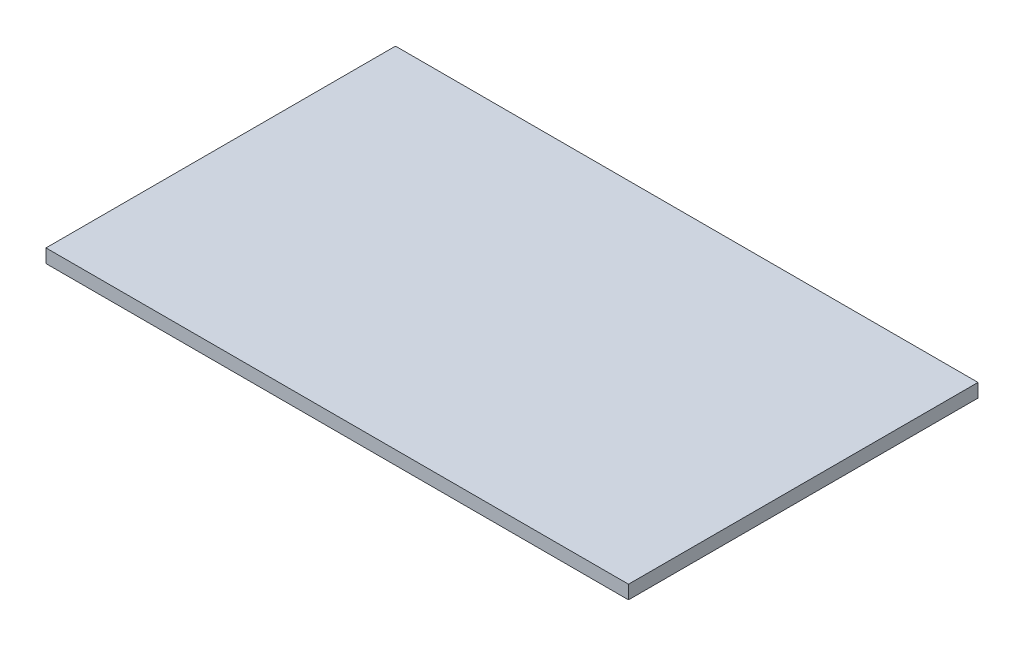
ISO-10303-21;
HEADER;
FILE_DESCRIPTION(('STEP AP214'),'2;1');
FILE_NAME('part.step','',(''),(''),'','','');
FILE_SCHEMA(('AUTOMOTIVE_DESIGN { 1 0 10303 214 1 1 1 1 }'));
ENDSEC;
DATA;
#1=APPLICATION_CONTEXT('core data for automotive mechanical design processes');
#2=APPLICATION_PROTOCOL_DEFINITION('international standard','automotive_design',2000,#1);
#3=PRODUCT_CONTEXT('',#1,'mechanical');
#4=PRODUCT('Part','Part','',(#3));
#5=PRODUCT_RELATED_PRODUCT_CATEGORY('part','',(#4));
#6=PRODUCT_DEFINITION_FORMATION('','',#4);
#7=PRODUCT_DEFINITION_CONTEXT('part definition',#1,'design');
#8=PRODUCT_DEFINITION('design','',#6,#7);
#9=PRODUCT_DEFINITION_SHAPE('','',#8);
#10=(LENGTH_UNIT() NAMED_UNIT(*) SI_UNIT(.MILLI.,.METRE.));
#11=(NAMED_UNIT(*) PLANE_ANGLE_UNIT() SI_UNIT($,.RADIAN.));
#12=(NAMED_UNIT(*) SI_UNIT($,.STERADIAN.) SOLID_ANGLE_UNIT());
#13=UNCERTAINTY_MEASURE_WITH_UNIT(LENGTH_MEASURE(1.E-05),#10,'distance_accuracy_value','');
#14=(GEOMETRIC_REPRESENTATION_CONTEXT(3) GLOBAL_UNCERTAINTY_ASSIGNED_CONTEXT((#13)) GLOBAL_UNIT_ASSIGNED_CONTEXT((#10,
#11,#12)) REPRESENTATION_CONTEXT('',''));
#15=CARTESIAN_POINT('',(0.,0.,0.));
#16=DIRECTION('',(0.,0.,1.));
#17=DIRECTION('',(1.,0.,0.));
#18=AXIS2_PLACEMENT_3D('',#15,#16,#17);
#19=CARTESIAN_POINT('',(-63.9378969654366,7.,-42.0062512471467));
#20=DIRECTION('',(1.,0.,0.));
#21=DIRECTION('',(0.,0.,-1.));
#22=AXIS2_PLACEMENT_3D('',#19,#20,#21);
#23=PLANE('',#22);
#24=DIRECTION('',(0.,0.,1.));
#25=VECTOR('',#24,1.);
#26=CARTESIAN_POINT('',(-63.9378969654366,0.,-42.0062512471467));
#27=LINE('',#26,#25);
#28=CARTESIAN_POINT('',(-63.9378969654366,0.,-42.0062512471467));
#29=VERTEX_POINT('',#28);
#30=CARTESIAN_POINT('',(-63.9378969654366,0.,137.993748752853));
#31=VERTEX_POINT('',#30);
#32=EDGE_CURVE('E107',#29,#31,#27,.T.);
#33=ORIENTED_EDGE('',*,*,#32,.T.);
#34=DIRECTION('',(0.,-1.,0.));
#35=VECTOR('',#34,1.);
#36=CARTESIAN_POINT('',(-63.9378969654366,7.,137.993748752853));
#37=LINE('',#36,#35);
#38=CARTESIAN_POINT('',(-63.9378969654366,7.,137.993748752853));
#39=VERTEX_POINT('',#38);
#40=EDGE_CURVE('E11',#39,#31,#37,.T.);
#41=ORIENTED_EDGE('',*,*,#40,.F.);
#42=DIRECTION('',(0.,0.,1.));
#43=VECTOR('',#42,1.);
#44=CARTESIAN_POINT('',(-63.9378969654366,7.,-42.0062512471467));
#45=LINE('',#44,#43);
#46=CARTESIAN_POINT('',(-63.9378969654366,7.,-42.0062512471467));
#47=VERTEX_POINT('',#46);
#48=EDGE_CURVE('E91',#47,#39,#45,.T.);
#49=ORIENTED_EDGE('',*,*,#48,.F.);
#50=DIRECTION('',(0.,-1.,0.));
#51=VECTOR('',#50,1.);
#52=CARTESIAN_POINT('',(-63.9378969654366,7.,-42.0062512471467));
#53=LINE('',#52,#51);
#54=EDGE_CURVE('E103',#47,#29,#53,.T.);
#55=ORIENTED_EDGE('',*,*,#54,.T.);
#56=EDGE_LOOP('',(#33,#41,#49,#55));
#57=FACE_BOUND('',#56,.T.);
#58=ADVANCED_FACE('F39',(#57),#23,.F.);
#59=CARTESIAN_POINT('',(-63.9378969654366,7.,137.993748752853));
#60=DIRECTION('',(0.,0.,-1.));
#61=DIRECTION('',(-1.,0.,0.));
#62=AXIS2_PLACEMENT_3D('',#59,#60,#61);
#63=PLANE('',#62);
#64=DIRECTION('',(1.,0.,0.));
#65=VECTOR('',#64,1.);
#66=CARTESIAN_POINT('',(-63.9378969654366,0.,137.993748752853));
#67=LINE('',#66,#65);
#68=CARTESIAN_POINT('',(236.062103034563,0.,137.993748752853));
#69=VERTEX_POINT('',#68);
#70=EDGE_CURVE('E96',#31,#69,#67,.T.);
#71=ORIENTED_EDGE('',*,*,#70,.T.);
#72=DIRECTION('',(0.,-1.,0.));
#73=VECTOR('',#72,1.);
#74=CARTESIAN_POINT('',(236.062103034563,7.,137.993748752853));
#75=LINE('',#74,#73);
#76=CARTESIAN_POINT('',(236.062103034563,7.,137.993748752853));
#77=VERTEX_POINT('',#76);
#78=EDGE_CURVE('E48',#77,#69,#75,.T.);
#79=ORIENTED_EDGE('',*,*,#78,.F.);
#80=DIRECTION('',(1.,0.,0.));
#81=VECTOR('',#80,1.);
#82=CARTESIAN_POINT('',(-63.9378969654366,7.,137.993748752853));
#83=LINE('',#82,#81);
#84=EDGE_CURVE('E86',#39,#77,#83,.T.);
#85=ORIENTED_EDGE('',*,*,#84,.F.);
#86=ORIENTED_EDGE('',*,*,#40,.T.);
#87=EDGE_LOOP('',(#71,#79,#85,#86));
#88=FACE_BOUND('',#87,.T.);
#89=ADVANCED_FACE('F95',(#88),#63,.F.);
#90=CARTESIAN_POINT('',(236.062103034563,7.,-42.0062512471467));
#91=DIRECTION('',(-1.,0.,0.));
#92=DIRECTION('',(0.,0.,1.));
#93=AXIS2_PLACEMENT_3D('',#90,#91,#92);
#94=PLANE('',#93);
#95=DIRECTION('',(0.,0.,-1.));
#96=VECTOR('',#95,1.);
#97=CARTESIAN_POINT('',(236.062103034563,0.,-42.0062512471467));
#98=LINE('',#97,#96);
#99=CARTESIAN_POINT('',(236.062103034563,0.,-42.0062512471467));
#100=VERTEX_POINT('',#99);
#101=EDGE_CURVE('E73',#69,#100,#98,.T.);
#102=ORIENTED_EDGE('',*,*,#101,.T.);
#103=DIRECTION('',(0.,-1.,0.));
#104=VECTOR('',#103,1.);
#105=CARTESIAN_POINT('',(236.062103034563,7.,-42.0062512471467));
#106=LINE('',#105,#104);
#107=CARTESIAN_POINT('',(236.062103034563,7.,-42.0062512471467));
#108=VERTEX_POINT('',#107);
#109=EDGE_CURVE('E98',#108,#100,#106,.T.);
#110=ORIENTED_EDGE('',*,*,#109,.F.);
#111=DIRECTION('',(0.,0.,-1.));
#112=VECTOR('',#111,1.);
#113=CARTESIAN_POINT('',(236.062103034563,7.,-42.0062512471467));
#114=LINE('',#113,#112);
#115=EDGE_CURVE('E89',#77,#108,#114,.T.);
#116=ORIENTED_EDGE('',*,*,#115,.F.);
#117=ORIENTED_EDGE('',*,*,#78,.T.);
#118=EDGE_LOOP('',(#102,#110,#116,#117));
#119=FACE_BOUND('',#118,.T.);
#120=ADVANCED_FACE('F99',(#119),#94,.F.);
#121=CARTESIAN_POINT('',(-63.9378969654366,7.,-42.0062512471467));
#122=DIRECTION('',(0.,0.,1.));
#123=DIRECTION('',(1.,0.,0.));
#124=AXIS2_PLACEMENT_3D('',#121,#122,#123);
#125=PLANE('',#124);
#126=DIRECTION('',(-1.,0.,0.));
#127=VECTOR('',#126,1.);
#128=CARTESIAN_POINT('',(-63.9378969654366,0.,-42.0062512471467));
#129=LINE('',#128,#127);
#130=EDGE_CURVE('E79',#100,#29,#129,.T.);
#131=ORIENTED_EDGE('',*,*,#130,.T.);
#132=ORIENTED_EDGE('',*,*,#54,.F.);
#133=DIRECTION('',(-1.,0.,0.));
#134=VECTOR('',#133,1.);
#135=CARTESIAN_POINT('',(-63.9378969654366,7.,-42.0062512471467));
#136=LINE('',#135,#134);
#137=EDGE_CURVE('E56',#108,#47,#136,.T.);
#138=ORIENTED_EDGE('',*,*,#137,.F.);
#139=ORIENTED_EDGE('',*,*,#109,.T.);
#140=EDGE_LOOP('',(#131,#132,#138,#139));
#141=FACE_BOUND('',#140,.T.);
#142=ADVANCED_FACE('F120',(#141),#125,.F.);
#143=CARTESIAN_POINT('',(0.,7.,0.));
#144=DIRECTION('',(0.,1.,0.));
#145=DIRECTION('',(0.,0.,1.));
#146=AXIS2_PLACEMENT_3D('',#143,#144,#145);
#147=PLANE('',#146);
#148=ORIENTED_EDGE('',*,*,#48,.T.);
#149=ORIENTED_EDGE('',*,*,#84,.T.);
#150=ORIENTED_EDGE('',*,*,#115,.T.);
#151=ORIENTED_EDGE('',*,*,#137,.T.);
#152=EDGE_LOOP('',(#148,#149,#150,#151));
#153=FACE_BOUND('',#152,.T.);
#154=ADVANCED_FACE('F87',(#153),#147,.T.);
#155=CARTESIAN_POINT('',(0.,0.,0.));
#156=DIRECTION('',(0.,1.,0.));
#157=DIRECTION('',(0.,0.,1.));
#158=AXIS2_PLACEMENT_3D('',#155,#156,#157);
#159=PLANE('',#158);
#160=ORIENTED_EDGE('',*,*,#32,.F.);
#161=ORIENTED_EDGE('',*,*,#130,.F.);
#162=ORIENTED_EDGE('',*,*,#101,.F.);
#163=ORIENTED_EDGE('',*,*,#70,.F.);
#164=EDGE_LOOP('',(#160,#161,#162,#163));
#165=FACE_BOUND('',#164,.T.);
#166=ADVANCED_FACE('F123',(#165),#159,.F.);
#167=CLOSED_SHELL('',(#58,#89,#120,#142,#154,#166));
#168=MANIFOLD_SOLID_BREP('B2',#167);
#169=ADVANCED_BREP_SHAPE_REPRESENTATION('',(#18,#168),#14);
#170=SHAPE_DEFINITION_REPRESENTATION(#9,#169);
ENDSEC;
END-ISO-10303-21;
